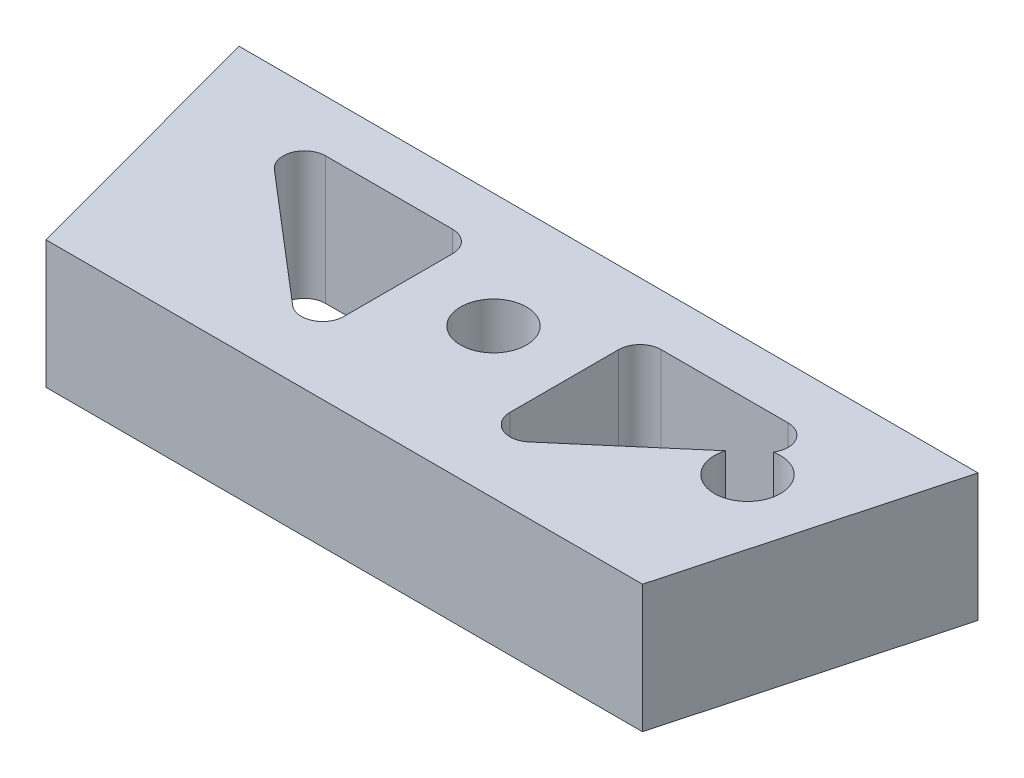
ISO-10303-21;
HEADER;
FILE_DESCRIPTION(('STEP AP214'),'2;1');
FILE_NAME('part.step','',(''),(''),'','','');
FILE_SCHEMA(('AUTOMOTIVE_DESIGN { 1 0 10303 214 1 1 1 1 }'));
ENDSEC;
DATA;
#1=APPLICATION_CONTEXT('core data for automotive mechanical design processes');
#2=APPLICATION_PROTOCOL_DEFINITION('international standard','automotive_design',2000,#1);
#3=PRODUCT_CONTEXT('',#1,'mechanical');
#4=PRODUCT('Part','Part','',(#3));
#5=PRODUCT_RELATED_PRODUCT_CATEGORY('part','',(#4));
#6=PRODUCT_DEFINITION_FORMATION('','',#4);
#7=PRODUCT_DEFINITION_CONTEXT('part definition',#1,'design');
#8=PRODUCT_DEFINITION('design','',#6,#7);
#9=PRODUCT_DEFINITION_SHAPE('','',#8);
#10=(LENGTH_UNIT() NAMED_UNIT(*) SI_UNIT(.MILLI.,.METRE.));
#11=(NAMED_UNIT(*) PLANE_ANGLE_UNIT() SI_UNIT($,.RADIAN.));
#12=(NAMED_UNIT(*) SI_UNIT($,.STERADIAN.) SOLID_ANGLE_UNIT());
#13=UNCERTAINTY_MEASURE_WITH_UNIT(LENGTH_MEASURE(1.E-05),#10,'distance_accuracy_value','');
#14=(GEOMETRIC_REPRESENTATION_CONTEXT(3) GLOBAL_UNCERTAINTY_ASSIGNED_CONTEXT((#13)) GLOBAL_UNIT_ASSIGNED_CONTEXT((#10,
#11,#12)) REPRESENTATION_CONTEXT('',''));
#15=CARTESIAN_POINT('',(0.,0.,0.));
#16=DIRECTION('',(0.,0.,1.));
#17=DIRECTION('',(1.,0.,0.));
#18=AXIS2_PLACEMENT_3D('',#15,#16,#17);
#19=CARTESIAN_POINT('',(0.,-1.,0.402774991180249));
#20=DIRECTION('',(0.,0.,1.));
#21=DIRECTION('',(1.,0.,0.));
#22=AXIS2_PLACEMENT_3D('',#19,#20,#21);
#23=PLANE('',#22);
#24=DIRECTION('',(0.,1.,0.));
#25=VECTOR('',#24,1.);
#26=CARTESIAN_POINT('',(-18.5018777464612,-1.,0.40277499118025));
#27=LINE('',#26,#25);
#28=CARTESIAN_POINT('',(-18.5018777464612,-1.,0.40277499118025));
#29=VERTEX_POINT('',#28);
#30=CARTESIAN_POINT('',(-18.5018777464612,5.,0.402774991180249));
#31=VERTEX_POINT('',#30);
#32=EDGE_CURVE('E204',#29,#31,#27,.T.);
#33=ORIENTED_EDGE('',*,*,#32,.T.);
#34=DIRECTION('',(-1.,0.,0.));
#35=VECTOR('',#34,1.);
#36=CARTESIAN_POINT('',(-18.5018777464612,5.,0.402774991180249));
#37=LINE('',#36,#35);
#38=CARTESIAN_POINT('',(16.1860491627566,5.,0.402774991180249));
#39=VERTEX_POINT('',#38);
#40=EDGE_CURVE('E278',#39,#31,#37,.T.);
#41=ORIENTED_EDGE('',*,*,#40,.F.);
#42=DIRECTION('',(0.,1.,0.));
#43=VECTOR('',#42,1.);
#44=CARTESIAN_POINT('',(16.1860491627566,-1.,0.402774991180249));
#45=LINE('',#44,#43);
#46=CARTESIAN_POINT('',(16.1860491627566,-1.,0.402774991180249));
#47=VERTEX_POINT('',#46);
#48=EDGE_CURVE('E48',#47,#39,#45,.T.);
#49=ORIENTED_EDGE('',*,*,#48,.F.);
#50=DIRECTION('',(1.,0.,0.));
#51=VECTOR('',#50,1.);
#52=CARTESIAN_POINT('',(0.,-1.,0.402774991180249));
#53=LINE('',#52,#51);
#54=EDGE_CURVE('E62',#29,#47,#53,.T.);
#55=ORIENTED_EDGE('',*,*,#54,.F.);
#56=EDGE_LOOP('',(#33,#41,#49,#55));
#57=FACE_BOUND('',#56,.T.);
#58=ADVANCED_FACE('F40',(#57),#23,.F.);
#59=CARTESIAN_POINT('',(15.1858113835841,-1.,4.10394808789721));
#60=DIRECTION('',(0.965368600757598,0.,0.260889755780707));
#61=DIRECTION('',(0.260889755780707,0.,-0.965368600757598));
#62=AXIS2_PLACEMENT_3D('',#59,#60,#61);
#63=PLANE('',#62);
#64=ORIENTED_EDGE('',*,*,#48,.T.);
#65=DIRECTION('',(0.260889755780707,0.,-0.965368600757598));
#66=VECTOR('',#65,1.);
#67=CARTESIAN_POINT('',(12.8349634022067,5.,12.8027749911802));
#68=LINE('',#67,#66);
#69=CARTESIAN_POINT('',(12.8349634022067,5.,12.8027749911802));
#70=VERTEX_POINT('',#69);
#71=EDGE_CURVE('E275',#70,#39,#68,.T.);
#72=ORIENTED_EDGE('',*,*,#71,.F.);
#73=DIRECTION('',(0.,1.,0.));
#74=VECTOR('',#73,1.);
#75=CARTESIAN_POINT('',(12.8349634022067,-1.,12.8027749911802));
#76=LINE('',#75,#74);
#77=CARTESIAN_POINT('',(12.8349634022067,-1.,12.8027749911802));
#78=VERTEX_POINT('',#77);
#79=EDGE_CURVE('E200',#78,#70,#76,.T.);
#80=ORIENTED_EDGE('',*,*,#79,.F.);
#81=DIRECTION('',(0.260889755780707,0.,-0.965368600757598));
#82=VECTOR('',#81,1.);
#83=CARTESIAN_POINT('',(15.1858113835841,-1.,4.10394808789721));
#84=LINE('',#83,#82);
#85=EDGE_CURVE('E195',#78,#47,#84,.T.);
#86=ORIENTED_EDGE('',*,*,#85,.T.);
#87=EDGE_LOOP('',(#64,#72,#80,#86));
#88=FACE_BOUND('',#87,.T.);
#89=ADVANCED_FACE('F328',(#88),#63,.T.);
#90=CARTESIAN_POINT('',(0.,-1.,12.8027749911803));
#91=DIRECTION('',(0.,0.,1.));
#92=DIRECTION('',(1.,0.,0.));
#93=AXIS2_PLACEMENT_3D('',#90,#91,#92);
#94=PLANE('',#93);
#95=ORIENTED_EDGE('',*,*,#79,.T.);
#96=DIRECTION('',(1.,0.,0.));
#97=VECTOR('',#96,1.);
#98=CARTESIAN_POINT('',(-15.1650365977933,5.,12.8027749911802));
#99=LINE('',#98,#97);
#100=CARTESIAN_POINT('',(-15.1650365977933,5.,12.8027749911802));
#101=VERTEX_POINT('',#100);
#102=EDGE_CURVE('E272',#101,#70,#99,.T.);
#103=ORIENTED_EDGE('',*,*,#102,.F.);
#104=DIRECTION('',(0.,1.,0.));
#105=VECTOR('',#104,1.);
#106=CARTESIAN_POINT('',(-15.1650365977933,-1.,12.8027749911802));
#107=LINE('',#106,#105);
#108=CARTESIAN_POINT('',(-15.1650365977933,-1.,12.8027749911802));
#109=VERTEX_POINT('',#108);
#110=EDGE_CURVE('E202',#109,#101,#107,.T.);
#111=ORIENTED_EDGE('',*,*,#110,.F.);
#112=DIRECTION('',(1.,0.,0.));
#113=VECTOR('',#112,1.);
#114=CARTESIAN_POINT('',(0.,-1.,12.8027749911803));
#115=LINE('',#114,#113);
#116=EDGE_CURVE('E192',#109,#78,#115,.T.);
#117=ORIENTED_EDGE('',*,*,#116,.T.);
#118=EDGE_LOOP('',(#95,#103,#111,#117));
#119=FACE_BOUND('',#118,.T.);
#120=ADVANCED_FACE('F334',(#119),#94,.T.);
#121=CARTESIAN_POINT('',(3.74005149891533,-1.,3.82742354793275));
#122=DIRECTION('',(0.,1.,0.));
#123=DIRECTION('',(0.,0.,1.));
#124=AXIS2_PLACEMENT_3D('',#121,#122,#123);
#125=CYLINDRICAL_SURFACE('',#124,1.);
#126=DIRECTION('',(0.,1.,0.));
#127=VECTOR('',#126,1.);
#128=CARTESIAN_POINT('',(3.74005149891533,-1.,2.82742354793275));
#129=LINE('',#128,#127);
#130=CARTESIAN_POINT('',(3.74005149891533,-1.,2.82742354793275));
#131=VERTEX_POINT('',#130);
#132=CARTESIAN_POINT('',(3.74005149891533,5.,2.82742354793275));
#133=VERTEX_POINT('',#132);
#134=EDGE_CURVE('E215',#131,#133,#129,.T.);
#135=ORIENTED_EDGE('',*,*,#134,.T.);
#136=CARTESIAN_POINT('',(3.74005149891533,5.,3.82742354793275));
#137=DIRECTION('',(0.,1.,0.));
#138=DIRECTION('',(0.,0.,1.));
#139=AXIS2_PLACEMENT_3D('',#136,#137,#138);
#140=CIRCLE('',#139,1.);
#141=CARTESIAN_POINT('',(2.74005149891533,5.,3.82742354793275));
#142=VERTEX_POINT('',#141);
#143=EDGE_CURVE('E266',#133,#142,#140,.T.);
#144=ORIENTED_EDGE('',*,*,#143,.T.);
#145=DIRECTION('',(0.,1.,0.));
#146=VECTOR('',#145,1.);
#147=CARTESIAN_POINT('',(2.74005149891533,-1.,3.82742354793275));
#148=LINE('',#147,#146);
#149=CARTESIAN_POINT('',(2.74005149891533,-1.,3.82742354793275));
#150=VERTEX_POINT('',#149);
#151=EDGE_CURVE('E206',#150,#142,#148,.T.);
#152=ORIENTED_EDGE('',*,*,#151,.F.);
#153=CARTESIAN_POINT('',(3.74005149891533,-1.,3.82742354793275));
#154=DIRECTION('',(0.,1.,0.));
#155=DIRECTION('',(0.,0.,1.));
#156=AXIS2_PLACEMENT_3D('',#153,#154,#155);
#157=CIRCLE('',#156,1.);
#158=EDGE_CURVE('E296',#131,#150,#157,.T.);
#159=ORIENTED_EDGE('',*,*,#158,.F.);
#160=EDGE_LOOP('',(#135,#144,#152,#159));
#161=FACE_BOUND('',#160,.T.);
#162=ADVANCED_FACE('F314',(#161),#125,.F.);
#163=CARTESIAN_POINT('',(2.74005149891533,-1.,0.));
#164=DIRECTION('',(1.,0.,0.));
#165=DIRECTION('',(0.,0.,-1.));
#166=AXIS2_PLACEMENT_3D('',#163,#164,#165);
#167=PLANE('',#166);
#168=ORIENTED_EDGE('',*,*,#151,.T.);
#169=DIRECTION('',(0.,0.,1.));
#170=VECTOR('',#169,1.);
#171=CARTESIAN_POINT('',(2.74005149891533,5.,8.92453681504574));
#172=LINE('',#171,#170);
#173=CARTESIAN_POINT('',(2.74005149891533,5.,8.92453681504574));
#174=VERTEX_POINT('',#173);
#175=EDGE_CURVE('E269',#142,#174,#172,.T.);
#176=ORIENTED_EDGE('',*,*,#175,.T.);
#177=DIRECTION('',(0.,1.,0.));
#178=VECTOR('',#177,1.);
#179=CARTESIAN_POINT('',(2.74005149891533,-1.,8.92453681504574));
#180=LINE('',#179,#178);
#181=CARTESIAN_POINT('',(2.74005149891533,-1.,8.92453681504574));
#182=VERTEX_POINT('',#181);
#183=EDGE_CURVE('E208',#182,#174,#180,.T.);
#184=ORIENTED_EDGE('',*,*,#183,.F.);
#185=DIRECTION('',(0.,0.,-1.));
#186=VECTOR('',#185,1.);
#187=CARTESIAN_POINT('',(2.74005149891533,-1.,0.));
#188=LINE('',#187,#186);
#189=EDGE_CURVE('E181',#182,#150,#188,.T.);
#190=ORIENTED_EDGE('',*,*,#189,.T.);
#191=EDGE_LOOP('',(#168,#176,#184,#190));
#192=FACE_BOUND('',#191,.T.);
#193=ADVANCED_FACE('F316',(#192),#167,.T.);
#194=CARTESIAN_POINT('',(3.74005149891534,-1.,8.92453681504574));
#195=DIRECTION('',(0.,1.,0.));
#196=DIRECTION('',(0.,0.,1.));
#197=AXIS2_PLACEMENT_3D('',#194,#195,#196);
#198=CYLINDRICAL_SURFACE('',#197,1.);
#199=ORIENTED_EDGE('',*,*,#183,.T.);
#200=CARTESIAN_POINT('',(3.74005149891534,5.,8.92453681504574));
#201=DIRECTION('',(0.,1.,0.));
#202=DIRECTION('',(0.,0.,-1.));
#203=AXIS2_PLACEMENT_3D('',#200,#201,#202);
#204=CIRCLE('',#203,1.);
#205=CARTESIAN_POINT('',(4.39031250669478,5.,9.68424769542172));
#206=VERTEX_POINT('',#205);
#207=EDGE_CURVE('E254',#174,#206,#204,.T.);
#208=ORIENTED_EDGE('',*,*,#207,.T.);
#209=DIRECTION('',(0.,1.,0.));
#210=VECTOR('',#209,1.);
#211=CARTESIAN_POINT('',(4.39031250669478,-1.,9.68424769542172));
#212=LINE('',#211,#210);
#213=CARTESIAN_POINT('',(4.39031250669478,-1.,9.68424769542172));
#214=VERTEX_POINT('',#213);
#215=EDGE_CURVE('E210',#214,#206,#212,.T.);
#216=ORIENTED_EDGE('',*,*,#215,.F.);
#217=CARTESIAN_POINT('',(3.74005149891534,-1.,8.92453681504574));
#218=DIRECTION('',(0.,1.,0.));
#219=DIRECTION('',(0.,0.,1.));
#220=AXIS2_PLACEMENT_3D('',#217,#218,#219);
#221=CIRCLE('',#220,1.);
#222=EDGE_CURVE('E178',#214,#182,#221,.F.);
#223=ORIENTED_EDGE('',*,*,#222,.T.);
#224=EDGE_LOOP('',(#199,#208,#216,#223));
#225=FACE_BOUND('',#224,.T.);
#226=ADVANCED_FACE('F318',(#225),#198,.F.);
#227=CARTESIAN_POINT('',(6.64051572703957,-1.,7.75822629495711));
#228=DIRECTION('',(-0.650261007779447,0.,-0.759710880375987));
#229=DIRECTION('',(-0.759710880375987,0.,0.650261007779447));
#230=AXIS2_PLACEMENT_3D('',#227,#228,#229);
#231=PLANE('',#230);
#232=DIRECTION('',(0.,1.,0.));
#233=VECTOR('',#232,1.);
#234=CARTESIAN_POINT('',(9.35916887958185,-5.38406204335659,5.43124351184889));
#235=LINE('',#234,#233);
#236=CARTESIAN_POINT('',(9.35916887958185,-1.,5.43124351184889));
#237=VERTEX_POINT('',#236);
#238=CARTESIAN_POINT('',(9.35916887958185,5.,5.43124351184889));
#239=VERTEX_POINT('',#238);
#240=EDGE_CURVE('E54',#237,#239,#235,.T.);
#241=ORIENTED_EDGE('',*,*,#240,.F.);
#242=DIRECTION('',(-0.759710880375987,0.,0.650261007779447));
#243=VECTOR('',#242,1.);
#244=CARTESIAN_POINT('',(6.64051572703957,-1.,7.75822629495711));
#245=LINE('',#244,#243);
#246=EDGE_CURVE('E168',#237,#214,#245,.T.);
#247=ORIENTED_EDGE('',*,*,#246,.T.);
#248=ORIENTED_EDGE('',*,*,#215,.T.);
#249=DIRECTION('',(0.759710880375987,0.,-0.650261007779447));
#250=VECTOR('',#249,1.);
#251=CARTESIAN_POINT('',(10.3453557296585,5.,4.58713442830873));
#252=LINE('',#251,#250);
#253=EDGE_CURVE('E171',#206,#239,#252,.T.);
#254=ORIENTED_EDGE('',*,*,#253,.T.);
#255=EDGE_LOOP('',(#241,#247,#248,#254));
#256=FACE_BOUND('',#255,.T.);
#257=ADVANCED_FACE('F167',(#256),#231,.T.);
#258=CARTESIAN_POINT('',(9.69509472187902,-1.,3.82742354793275));
#259=DIRECTION('',(0.,1.,0.));
#260=DIRECTION('',(0.,0.,1.));
#261=AXIS2_PLACEMENT_3D('',#258,#259,#260);
#262=CYLINDRICAL_SURFACE('',#261,1.);
#263=CARTESIAN_POINT('',(9.69509472187902,-1.,3.82742354793275));
#264=DIRECTION('',(0.,1.,0.));
#265=DIRECTION('',(0.,0.,1.));
#266=AXIS2_PLACEMENT_3D('',#263,#264,#265);
#267=CIRCLE('',#266,1.);
#268=CARTESIAN_POINT('',(10.5402249757453,-1.,4.36198397856702));
#269=VERTEX_POINT('',#268);
#270=CARTESIAN_POINT('',(9.69509472187902,-1.,2.82742354793275));
#271=VERTEX_POINT('',#270);
#272=EDGE_CURVE('E179',#269,#271,#267,.T.);
#273=ORIENTED_EDGE('',*,*,#272,.F.);
#274=DIRECTION('',(0.,1.,0.));
#275=VECTOR('',#274,1.);
#276=CARTESIAN_POINT('',(10.5402249757453,2.,4.36198397856702));
#277=LINE('',#276,#275);
#278=CARTESIAN_POINT('',(10.5402249757453,5.,4.36198397856702));
#279=VERTEX_POINT('',#278);
#280=EDGE_CURVE('E160',#269,#279,#277,.T.);
#281=ORIENTED_EDGE('',*,*,#280,.T.);
#282=CARTESIAN_POINT('',(9.69509472187902,5.,3.82742354793275));
#283=DIRECTION('',(0.,1.,0.));
#284=DIRECTION('',(0.,0.,1.));
#285=AXIS2_PLACEMENT_3D('',#282,#283,#284);
#286=CIRCLE('',#285,1.);
#287=CARTESIAN_POINT('',(9.69509472187902,5.,2.82742354793275));
#288=VERTEX_POINT('',#287);
#289=EDGE_CURVE('E261',#279,#288,#286,.T.);
#290=ORIENTED_EDGE('',*,*,#289,.T.);
#291=DIRECTION('',(0.,1.,0.));
#292=VECTOR('',#291,1.);
#293=CARTESIAN_POINT('',(9.69509472187902,-1.,2.82742354793275));
#294=LINE('',#293,#292);
#295=EDGE_CURVE('E212',#271,#288,#294,.T.);
#296=ORIENTED_EDGE('',*,*,#295,.F.);
#297=EDGE_LOOP('',(#273,#281,#290,#296));
#298=FACE_BOUND('',#297,.T.);
#299=ADVANCED_FACE('F306',(#298),#262,.F.);
#300=CARTESIAN_POINT('',(-12.0109233055837,-1.,3.82742354793275));
#301=DIRECTION('',(0.,1.,0.));
#302=DIRECTION('',(0.,0.,1.));
#303=AXIS2_PLACEMENT_3D('',#300,#301,#302);
#304=CYLINDRICAL_SURFACE('',#303,1.);
#305=DIRECTION('',(0.,1.,0.));
#306=VECTOR('',#305,1.);
#307=CARTESIAN_POINT('',(-12.0109233055837,-1.,2.82742354793275));
#308=LINE('',#307,#306);
#309=CARTESIAN_POINT('',(-12.0109233055837,-1.,2.82742354793275));
#310=VERTEX_POINT('',#309);
#311=CARTESIAN_POINT('',(-12.0109233055837,5.,2.82742354793275));
#312=VERTEX_POINT('',#311);
#313=EDGE_CURVE('E198',#310,#312,#308,.T.);
#314=ORIENTED_EDGE('',*,*,#313,.T.);
#315=CARTESIAN_POINT('',(-12.0109233055837,5.,3.82742354793275));
#316=DIRECTION('',(0.,1.,0.));
#317=DIRECTION('',(0.,0.,1.));
#318=AXIS2_PLACEMENT_3D('',#315,#316,#317);
#319=CIRCLE('',#318,1.);
#320=CARTESIAN_POINT('',(-12.6611843133631,5.,4.58713442830874));
#321=VERTEX_POINT('',#320);
#322=EDGE_CURVE('E233',#312,#321,#319,.T.);
#323=ORIENTED_EDGE('',*,*,#322,.T.);
#324=DIRECTION('',(0.,1.,0.));
#325=VECTOR('',#324,1.);
#326=CARTESIAN_POINT('',(-12.6611843133631,-1.,4.58713442830874));
#327=LINE('',#326,#325);
#328=CARTESIAN_POINT('',(-12.6611843133631,-1.,4.58713442830874));
#329=VERTEX_POINT('',#328);
#330=EDGE_CURVE('E217',#329,#321,#327,.T.);
#331=ORIENTED_EDGE('',*,*,#330,.F.);
#332=CARTESIAN_POINT('',(-12.0109233055837,-1.,3.82742354793275));
#333=DIRECTION('',(0.,1.,0.));
#334=DIRECTION('',(0.,0.,1.));
#335=AXIS2_PLACEMENT_3D('',#332,#333,#334);
#336=CIRCLE('',#335,1.);
#337=EDGE_CURVE('E236',#310,#329,#336,.T.);
#338=ORIENTED_EDGE('',*,*,#337,.F.);
#339=EDGE_LOOP('',(#314,#323,#331,#338));
#340=FACE_BOUND('',#339,.T.);
#341=ADVANCED_FACE('F42',(#340),#304,.F.);
#342=CARTESIAN_POINT('',(-7.61973924547981,-1.,8.90226961353088));
#343=DIRECTION('',(-0.650261007779446,0.,0.759710880375988));
#344=DIRECTION('',(0.759710880375988,0.,0.650261007779446));
#345=AXIS2_PLACEMENT_3D('',#342,#343,#344);
#346=PLANE('',#345);
#347=ORIENTED_EDGE('',*,*,#330,.T.);
#348=DIRECTION('',(0.759710880375988,0.,0.650261007779446));
#349=VECTOR('',#348,1.);
#350=CARTESIAN_POINT('',(-12.6611843133631,5.,4.58713442830874));
#351=LINE('',#350,#349);
#352=CARTESIAN_POINT('',(-6.70614109039943,5.,9.68424769542171));
#353=VERTEX_POINT('',#352);
#354=EDGE_CURVE('E252',#321,#353,#351,.T.);
#355=ORIENTED_EDGE('',*,*,#354,.T.);
#356=DIRECTION('',(0.,1.,0.));
#357=VECTOR('',#356,1.);
#358=CARTESIAN_POINT('',(-6.70614109039943,-1.,9.68424769542171));
#359=LINE('',#358,#357);
#360=CARTESIAN_POINT('',(-6.70614109039943,-1.,9.68424769542171));
#361=VERTEX_POINT('',#360);
#362=EDGE_CURVE('E219',#361,#353,#359,.T.);
#363=ORIENTED_EDGE('',*,*,#362,.F.);
#364=DIRECTION('',(0.759710880375988,0.,0.650261007779446));
#365=VECTOR('',#364,1.);
#366=CARTESIAN_POINT('',(-7.61973924547981,-1.,8.90226961353088));
#367=LINE('',#366,#365);
#368=EDGE_CURVE('E294',#329,#361,#367,.T.);
#369=ORIENTED_EDGE('',*,*,#368,.F.);
#370=EDGE_LOOP('',(#347,#355,#363,#369));
#371=FACE_BOUND('',#370,.T.);
#372=ADVANCED_FACE('F409',(#371),#346,.F.);
#373=CARTESIAN_POINT('',(-6.05588008261997,-1.,8.92453681504573));
#374=DIRECTION('',(0.,1.,0.));
#375=DIRECTION('',(0.,0.,1.));
#376=AXIS2_PLACEMENT_3D('',#373,#374,#375);
#377=CYLINDRICAL_SURFACE('',#376,1.);
#378=ORIENTED_EDGE('',*,*,#362,.T.);
#379=CARTESIAN_POINT('',(-6.05588008261997,5.,8.92453681504573));
#380=DIRECTION('',(0.,1.,0.));
#381=DIRECTION('',(0.,0.,-1.));
#382=AXIS2_PLACEMENT_3D('',#379,#380,#381);
#383=CIRCLE('',#382,1.);
#384=CARTESIAN_POINT('',(-5.05588008261997,5.,8.92453681504573));
#385=VERTEX_POINT('',#384);
#386=EDGE_CURVE('E563',#353,#385,#383,.T.);
#387=ORIENTED_EDGE('',*,*,#386,.T.);
#388=DIRECTION('',(0.,1.,0.));
#389=VECTOR('',#388,1.);
#390=CARTESIAN_POINT('',(-5.05588008261997,-1.,8.92453681504573));
#391=LINE('',#390,#389);
#392=CARTESIAN_POINT('',(-5.05588008261997,-1.,8.92453681504573));
#393=VERTEX_POINT('',#392);
#394=EDGE_CURVE('E221',#393,#385,#391,.T.);
#395=ORIENTED_EDGE('',*,*,#394,.F.);
#396=CARTESIAN_POINT('',(-6.05588008261997,-1.,8.92453681504573));
#397=DIRECTION('',(0.,1.,0.));
#398=DIRECTION('',(0.,0.,1.));
#399=AXIS2_PLACEMENT_3D('',#396,#397,#398);
#400=CIRCLE('',#399,1.);
#401=EDGE_CURVE('E291',#393,#361,#400,.F.);
#402=ORIENTED_EDGE('',*,*,#401,.T.);
#403=EDGE_LOOP('',(#378,#387,#395,#402));
#404=FACE_BOUND('',#403,.T.);
#405=ADVANCED_FACE('F401',(#404),#377,.F.);
#406=CARTESIAN_POINT('',(-5.05588008261997,-1.,0.));
#407=DIRECTION('',(1.,0.,0.));
#408=DIRECTION('',(0.,0.,-1.));
#409=AXIS2_PLACEMENT_3D('',#406,#407,#408);
#410=PLANE('',#409);
#411=ORIENTED_EDGE('',*,*,#394,.T.);
#412=DIRECTION('',(0.,0.,-1.));
#413=VECTOR('',#412,1.);
#414=CARTESIAN_POINT('',(-5.05588008261997,5.,8.92453681504573));
#415=LINE('',#414,#413);
#416=CARTESIAN_POINT('',(-5.05588008261997,5.,3.82742354793275));
#417=VERTEX_POINT('',#416);
#418=EDGE_CURVE('E562',#385,#417,#415,.T.);
#419=ORIENTED_EDGE('',*,*,#418,.T.);
#420=DIRECTION('',(0.,1.,0.));
#421=VECTOR('',#420,1.);
#422=CARTESIAN_POINT('',(-5.05588008261997,-1.,3.82742354793275));
#423=LINE('',#422,#421);
#424=CARTESIAN_POINT('',(-5.05588008261997,-1.,3.82742354793275));
#425=VERTEX_POINT('',#424);
#426=EDGE_CURVE('E223',#425,#417,#423,.T.);
#427=ORIENTED_EDGE('',*,*,#426,.F.);
#428=DIRECTION('',(0.,0.,-1.));
#429=VECTOR('',#428,1.);
#430=CARTESIAN_POINT('',(-5.05588008261997,-1.,0.));
#431=LINE('',#430,#429);
#432=EDGE_CURVE('E289',#393,#425,#431,.T.);
#433=ORIENTED_EDGE('',*,*,#432,.F.);
#434=EDGE_LOOP('',(#411,#419,#427,#433));
#435=FACE_BOUND('',#434,.T.);
#436=ADVANCED_FACE('F393',(#435),#410,.F.);
#437=CARTESIAN_POINT('',(-6.05588008261997,-1.,3.82742354793275));
#438=DIRECTION('',(0.,1.,0.));
#439=DIRECTION('',(0.,0.,1.));
#440=AXIS2_PLACEMENT_3D('',#437,#438,#439);
#441=CYLINDRICAL_SURFACE('',#440,1.);
#442=ORIENTED_EDGE('',*,*,#426,.T.);
#443=CARTESIAN_POINT('',(-6.05588008261997,5.,3.82742354793275));
#444=DIRECTION('',(0.,1.,0.));
#445=DIRECTION('',(0.,0.,1.));
#446=AXIS2_PLACEMENT_3D('',#443,#444,#445);
#447=CIRCLE('',#446,1.);
#448=CARTESIAN_POINT('',(-6.05588008261997,5.,2.82742354793275));
#449=VERTEX_POINT('',#448);
#450=EDGE_CURVE('E246',#417,#449,#447,.T.);
#451=ORIENTED_EDGE('',*,*,#450,.T.);
#452=DIRECTION('',(0.,1.,0.));
#453=VECTOR('',#452,1.);
#454=CARTESIAN_POINT('',(-6.05588008261997,-1.,2.82742354793275));
#455=LINE('',#454,#453);
#456=CARTESIAN_POINT('',(-6.05588008261997,-1.,2.82742354793275));
#457=VERTEX_POINT('',#456);
#458=EDGE_CURVE('E225',#457,#449,#455,.T.);
#459=ORIENTED_EDGE('',*,*,#458,.F.);
#460=CARTESIAN_POINT('',(-6.05588008261997,-1.,3.82742354793275));
#461=DIRECTION('',(0.,1.,0.));
#462=DIRECTION('',(0.,0.,1.));
#463=AXIS2_PLACEMENT_3D('',#460,#461,#462);
#464=CIRCLE('',#463,1.);
#465=EDGE_CURVE('E287',#425,#457,#464,.T.);
#466=ORIENTED_EDGE('',*,*,#465,.F.);
#467=EDGE_LOOP('',(#442,#451,#459,#466));
#468=FACE_BOUND('',#467,.T.);
#469=ADVANCED_FACE('F386',(#468),#441,.F.);
#470=CARTESIAN_POINT('',(0.,-1.,2.82742354793275));
#471=DIRECTION('',(0.,0.,1.));
#472=DIRECTION('',(1.,0.,0.));
#473=AXIS2_PLACEMENT_3D('',#470,#471,#472);
#474=PLANE('',#473);
#475=ORIENTED_EDGE('',*,*,#295,.T.);
#476=DIRECTION('',(-1.,0.,0.));
#477=VECTOR('',#476,1.);
#478=CARTESIAN_POINT('',(3.74005149891533,5.,2.82742354793275));
#479=LINE('',#478,#477);
#480=EDGE_CURVE('E263',#288,#133,#479,.T.);
#481=ORIENTED_EDGE('',*,*,#480,.T.);
#482=ORIENTED_EDGE('',*,*,#134,.F.);
#483=DIRECTION('',(1.,0.,0.));
#484=VECTOR('',#483,1.);
#485=CARTESIAN_POINT('',(0.,-1.,2.82742354793275));
#486=LINE('',#485,#484);
#487=EDGE_CURVE('E183',#131,#271,#486,.T.);
#488=ORIENTED_EDGE('',*,*,#487,.T.);
#489=EDGE_LOOP('',(#475,#481,#482,#488));
#490=FACE_BOUND('',#489,.T.);
#491=ADVANCED_FACE('F300',(#490),#474,.T.);
#492=CARTESIAN_POINT('',(0.,-1.,2.82742354793275));
#493=DIRECTION('',(0.,0.,-1.));
#494=DIRECTION('',(-1.,0.,0.));
#495=AXIS2_PLACEMENT_3D('',#492,#493,#494);
#496=PLANE('',#495);
#497=ORIENTED_EDGE('',*,*,#458,.T.);
#498=DIRECTION('',(-1.,0.,0.));
#499=VECTOR('',#498,1.);
#500=CARTESIAN_POINT('',(-6.05588008261997,5.,2.82742354793275));
#501=LINE('',#500,#499);
#502=EDGE_CURVE('E240',#449,#312,#501,.T.);
#503=ORIENTED_EDGE('',*,*,#502,.T.);
#504=ORIENTED_EDGE('',*,*,#313,.F.);
#505=DIRECTION('',(-1.,0.,0.));
#506=VECTOR('',#505,1.);
#507=CARTESIAN_POINT('',(0.,-1.,2.82742354793275));
#508=LINE('',#507,#506);
#509=EDGE_CURVE('E285',#457,#310,#508,.T.);
#510=ORIENTED_EDGE('',*,*,#509,.F.);
#511=EDGE_LOOP('',(#497,#503,#504,#510));
#512=FACE_BOUND('',#511,.T.);
#513=ADVANCED_FACE('F241',(#512),#496,.F.);
#514=CARTESIAN_POINT('',(-17.353605615274,-1.,4.66985687861304));
#515=DIRECTION('',(0.965647428770982,0.,-0.25985581253455));
#516=DIRECTION('',(-0.25985581253455,0.,-0.965647428770982));
#517=AXIS2_PLACEMENT_3D('',#514,#515,#516);
#518=PLANE('',#517);
#519=ORIENTED_EDGE('',*,*,#110,.T.);
#520=DIRECTION('',(0.25985581253455,0.,0.965647428770982));
#521=VECTOR('',#520,1.);
#522=CARTESIAN_POINT('',(-15.1650365977933,5.,12.8027749911802));
#523=LINE('',#522,#521);
#524=EDGE_CURVE('E281',#31,#101,#523,.T.);
#525=ORIENTED_EDGE('',*,*,#524,.F.);
#526=ORIENTED_EDGE('',*,*,#32,.F.);
#527=DIRECTION('',(-0.25985581253455,0.,-0.965647428770982));
#528=VECTOR('',#527,1.);
#529=CARTESIAN_POINT('',(-17.353605615274,-1.,4.66985687861304));
#530=LINE('',#529,#528);
#531=EDGE_CURVE('E190',#109,#29,#530,.T.);
#532=ORIENTED_EDGE('',*,*,#531,.F.);
#533=EDGE_LOOP('',(#519,#525,#526,#532));
#534=FACE_BOUND('',#533,.T.);
#535=ADVANCED_FACE('F338',(#534),#518,.F.);
#536=CARTESIAN_POINT('',(0.,-1.,0.));
#537=DIRECTION('',(0.,1.,0.));
#538=DIRECTION('',(0.,0.,1.));
#539=AXIS2_PLACEMENT_3D('',#536,#537,#538);
#540=PLANE('',#539);
#541=CARTESIAN_POINT('',(-1.15791429185232,-1.,5.80277499118023));
#542=DIRECTION('',(0.,1.,0.));
#543=DIRECTION('',(0.,0.,1.));
#544=AXIS2_PLACEMENT_3D('',#541,#542,#543);
#545=CIRCLE('',#544,1.55);
#546=CARTESIAN_POINT('',(-1.15791429185232,-1.,7.35277499118023));
#547=VERTEX_POINT('',#546);
#548=EDGE_CURVE('E568',#547,#547,#545,.F.);
#549=ORIENTED_EDGE('',*,*,#548,.F.);
#550=EDGE_LOOP('',(#549));
#551=FACE_BOUND('',#550,.T.);
#552=ORIENTED_EDGE('',*,*,#337,.T.);
#553=ORIENTED_EDGE('',*,*,#368,.T.);
#554=ORIENTED_EDGE('',*,*,#401,.F.);
#555=ORIENTED_EDGE('',*,*,#432,.T.);
#556=ORIENTED_EDGE('',*,*,#465,.T.);
#557=ORIENTED_EDGE('',*,*,#509,.T.);
#558=EDGE_LOOP('',(#552,#553,#554,#555,#556,#557));
#559=FACE_BOUND('',#558,.T.);
#560=ORIENTED_EDGE('',*,*,#246,.F.);
#561=CARTESIAN_POINT('',(10.8420857081477,-1.,5.88230634511745));
#562=DIRECTION('',(0.,1.,0.));
#563=DIRECTION('',(0.,0.,1.));
#564=AXIS2_PLACEMENT_3D('',#561,#562,#563);
#565=CIRCLE('',#564,1.55);
#566=EDGE_CURVE('E157',#269,#237,#565,.F.);
#567=ORIENTED_EDGE('',*,*,#566,.F.);
#568=ORIENTED_EDGE('',*,*,#272,.T.);
#569=ORIENTED_EDGE('',*,*,#487,.F.);
#570=ORIENTED_EDGE('',*,*,#158,.T.);
#571=ORIENTED_EDGE('',*,*,#189,.F.);
#572=ORIENTED_EDGE('',*,*,#222,.F.);
#573=EDGE_LOOP('',(#560,#567,#568,#569,#570,#571,#572));
#574=FACE_BOUND('',#573,.T.);
#575=ORIENTED_EDGE('',*,*,#54,.T.);
#576=ORIENTED_EDGE('',*,*,#85,.F.);
#577=ORIENTED_EDGE('',*,*,#116,.F.);
#578=ORIENTED_EDGE('',*,*,#531,.T.);
#579=EDGE_LOOP('',(#575,#576,#577,#578));
#580=FACE_BOUND('',#579,.T.);
#581=ADVANCED_FACE('F175',(#551,#559,#574,#580),#540,.F.);
#582=CARTESIAN_POINT('',(0.,5.,0.));
#583=DIRECTION('',(0.,1.,0.));
#584=DIRECTION('',(0.,0.,1.));
#585=AXIS2_PLACEMENT_3D('',#582,#583,#584);
#586=PLANE('',#585);
#587=CARTESIAN_POINT('',(10.8420857081477,5.,5.88230634511745));
#588=DIRECTION('',(0.,1.,0.));
#589=DIRECTION('',(0.,0.,1.));
#590=AXIS2_PLACEMENT_3D('',#587,#588,#589);
#591=CIRCLE('',#590,1.55);
#592=EDGE_CURVE('E11',#239,#279,#591,.T.);
#593=ORIENTED_EDGE('',*,*,#592,.F.);
#594=ORIENTED_EDGE('',*,*,#253,.F.);
#595=ORIENTED_EDGE('',*,*,#207,.F.);
#596=ORIENTED_EDGE('',*,*,#175,.F.);
#597=ORIENTED_EDGE('',*,*,#143,.F.);
#598=ORIENTED_EDGE('',*,*,#480,.F.);
#599=ORIENTED_EDGE('',*,*,#289,.F.);
#600=EDGE_LOOP('',(#593,#594,#595,#596,#597,#598,#599));
#601=FACE_BOUND('',#600,.T.);
#602=CARTESIAN_POINT('',(-1.15791429185232,5.,5.80277499118023));
#603=DIRECTION('',(0.,1.,0.));
#604=DIRECTION('',(0.,0.,1.));
#605=AXIS2_PLACEMENT_3D('',#602,#603,#604);
#606=CIRCLE('',#605,1.55);
#607=CARTESIAN_POINT('',(-1.15791429185232,5.,7.35277499118023));
#608=VERTEX_POINT('',#607);
#609=EDGE_CURVE('E172',#608,#608,#606,.T.);
#610=ORIENTED_EDGE('',*,*,#609,.F.);
#611=EDGE_LOOP('',(#610));
#612=FACE_BOUND('',#611,.T.);
#613=ORIENTED_EDGE('',*,*,#102,.T.);
#614=ORIENTED_EDGE('',*,*,#71,.T.);
#615=ORIENTED_EDGE('',*,*,#40,.T.);
#616=ORIENTED_EDGE('',*,*,#524,.T.);
#617=EDGE_LOOP('',(#613,#614,#615,#616));
#618=FACE_BOUND('',#617,.T.);
#619=ORIENTED_EDGE('',*,*,#418,.F.);
#620=ORIENTED_EDGE('',*,*,#386,.F.);
#621=ORIENTED_EDGE('',*,*,#354,.F.);
#622=ORIENTED_EDGE('',*,*,#322,.F.);
#623=ORIENTED_EDGE('',*,*,#502,.F.);
#624=ORIENTED_EDGE('',*,*,#450,.F.);
#625=EDGE_LOOP('',(#619,#620,#621,#622,#623,#624));
#626=FACE_BOUND('',#625,.T.);
#627=ADVANCED_FACE('F249',(#601,#612,#618,#626),#586,.T.);
#628=CARTESIAN_POINT('',(-1.15791429185232,-1.001,5.80277499118023));
#629=DIRECTION('',(0.,1.,0.));
#630=DIRECTION('',(0.,0.,1.));
#631=AXIS2_PLACEMENT_3D('',#628,#629,#630);
#632=CYLINDRICAL_SURFACE('',#631,1.55);
#633=CARTESIAN_POINT('',(-1.15791429185232,5.,7.35277499118023));
#634=CARTESIAN_POINT('',(-1.15791429185232,4.9375,7.35277499118023));
#635=CARTESIAN_POINT('',(-1.15791429185232,4.875,7.35277499118023));
#636=CARTESIAN_POINT('',(-1.15791429185232,4.75,7.35277499118023));
#637=CARTESIAN_POINT('',(-1.15791429185232,4.6875,7.35277499118023));
#638=CARTESIAN_POINT('',(-1.15791429185232,4.5625,7.35277499118023));
#639=CARTESIAN_POINT('',(-1.15791429185232,4.5,7.35277499118023));
#640=CARTESIAN_POINT('',(-1.15791429185232,4.375,7.35277499118023));
#641=CARTESIAN_POINT('',(-1.15791429185232,4.3125,7.35277499118023));
#642=CARTESIAN_POINT('',(-1.15791429185232,4.1875,7.35277499118023));
#643=CARTESIAN_POINT('',(-1.15791429185232,4.125,7.35277499118023));
#644=CARTESIAN_POINT('',(-1.15791429185232,4.,7.35277499118023));
#645=CARTESIAN_POINT('',(-1.15791429185232,3.9375,7.35277499118023));
#646=CARTESIAN_POINT('',(-1.15791429185232,3.8125,7.35277499118023));
#647=CARTESIAN_POINT('',(-1.15791429185232,3.75,7.35277499118023));
#648=CARTESIAN_POINT('',(-1.15791429185232,3.625,7.35277499118023));
#649=CARTESIAN_POINT('',(-1.15791429185232,3.5625,7.35277499118023));
#650=CARTESIAN_POINT('',(-1.15791429185232,3.4375,7.35277499118023));
#651=CARTESIAN_POINT('',(-1.15791429185232,3.375,7.35277499118023));
#652=CARTESIAN_POINT('',(-1.15791429185232,3.25,7.35277499118023));
#653=CARTESIAN_POINT('',(-1.15791429185232,3.1875,7.35277499118023));
#654=CARTESIAN_POINT('',(-1.15791429185232,3.0625,7.35277499118023));
#655=CARTESIAN_POINT('',(-1.15791429185232,3.,7.35277499118023));
#656=CARTESIAN_POINT('',(-1.15791429185232,2.875,7.35277499118023));
#657=CARTESIAN_POINT('',(-1.15791429185232,2.8125,7.35277499118023));
#658=CARTESIAN_POINT('',(-1.15791429185232,2.6875,7.35277499118023));
#659=CARTESIAN_POINT('',(-1.15791429185232,2.625,7.35277499118023));
#660=CARTESIAN_POINT('',(-1.15791429185232,2.5,7.35277499118023));
#661=CARTESIAN_POINT('',(-1.15791429185232,2.4375,7.35277499118023));
#662=CARTESIAN_POINT('',(-1.15791429185232,2.3125,7.35277499118023));
#663=CARTESIAN_POINT('',(-1.15791429185232,2.25,7.35277499118023));
#664=CARTESIAN_POINT('',(-1.15791429185232,2.125,7.35277499118023));
#665=CARTESIAN_POINT('',(-1.15791429185232,2.0625,7.35277499118023));
#666=CARTESIAN_POINT('',(-1.15791429185232,1.9375,7.35277499118023));
#667=CARTESIAN_POINT('',(-1.15791429185232,1.875,7.35277499118023));
#668=CARTESIAN_POINT('',(-1.15791429185232,1.75,7.35277499118023));
#669=CARTESIAN_POINT('',(-1.15791429185232,1.6875,7.35277499118023));
#670=CARTESIAN_POINT('',(-1.15791429185232,1.5625,7.35277499118023));
#671=CARTESIAN_POINT('',(-1.15791429185232,1.5,7.35277499118023));
#672=CARTESIAN_POINT('',(-1.15791429185232,1.375,7.35277499118023));
#673=CARTESIAN_POINT('',(-1.15791429185232,1.3125,7.35277499118023));
#674=CARTESIAN_POINT('',(-1.15791429185232,1.1875,7.35277499118023));
#675=CARTESIAN_POINT('',(-1.15791429185232,1.125,7.35277499118023));
#676=CARTESIAN_POINT('',(-1.15791429185232,1.,7.35277499118023));
#677=CARTESIAN_POINT('',(-1.15791429185232,0.9375,7.35277499118023));
#678=CARTESIAN_POINT('',(-1.15791429185232,0.8125,7.35277499118023));
#679=CARTESIAN_POINT('',(-1.15791429185232,0.75,7.35277499118023));
#680=CARTESIAN_POINT('',(-1.15791429185232,0.625,7.35277499118023));
#681=CARTESIAN_POINT('',(-1.15791429185232,0.5625,7.35277499118023));
#682=CARTESIAN_POINT('',(-1.15791429185232,0.4375,7.35277499118023));
#683=CARTESIAN_POINT('',(-1.15791429185232,0.375,7.35277499118023));
#684=CARTESIAN_POINT('',(-1.15791429185232,0.25,7.35277499118023));
#685=CARTESIAN_POINT('',(-1.15791429185232,0.1875,7.35277499118023));
#686=CARTESIAN_POINT('',(-1.15791429185232,0.0624999999999999,7.35277499118023));
#687=CARTESIAN_POINT('',(-1.15791429185232,0.,7.35277499118023));
#688=CARTESIAN_POINT('',(-1.15791429185232,-0.125,7.35277499118023));
#689=CARTESIAN_POINT('',(-1.15791429185232,-0.1875,7.35277499118023));
#690=CARTESIAN_POINT('',(-1.15791429185232,-0.3125,7.35277499118023));
#691=CARTESIAN_POINT('',(-1.15791429185232,-0.375,7.35277499118023));
#692=CARTESIAN_POINT('',(-1.15791429185232,-0.5,7.35277499118023));
#693=CARTESIAN_POINT('',(-1.15791429185232,-0.5625,7.35277499118023));
#694=CARTESIAN_POINT('',(-1.15791429185232,-0.6875,7.35277499118023));
#695=CARTESIAN_POINT('',(-1.15791429185232,-0.75,7.35277499118023));
#696=CARTESIAN_POINT('',(-1.15791429185232,-0.875,7.35277499118023));
#697=CARTESIAN_POINT('',(-1.15791429185232,-0.9375,7.35277499118023));
#698=CARTESIAN_POINT('',(-1.15791429185232,-1.,7.35277499118023));
#699=B_SPLINE_CURVE_WITH_KNOTS('',3,(#633,#634,#635,#636,#637,#638,#639,#640,#641,#642,#643,
#644,#645,#646,#647,#648,#649,#650,#651,#652,#653,#654,#655,#656,#657,#658,#659,#660,#661,#662,
#663,#664,#665,#666,#667,#668,#669,#670,#671,#672,#673,#674,#675,#676,#677,#678,#679,#680,#681,
#682,#683,#684,#685,#686,#687,#688,#689,#690,#691,#692,#693,#694,#695,#696,#697,#698),
.UNSPECIFIED.,.F.,.F.,(4,2,2,2,2,2,2,2,2,2,2,2,2,2,2,2,2,2,2,2,2,2,2,2,2,2,2,2,2,2,2,2,4),(0.,
0.1875,0.375,0.5625,0.75,0.9375,1.125,1.3125,1.5,1.6875,1.875,2.0625,2.25,2.4375,2.625,2.8125,
3.,3.1875,3.375,3.5625,3.75,3.9375,4.125,4.3125,4.5,4.6875,4.875,5.0625,5.25,5.4375,5.625,
5.8125,6.),.UNSPECIFIED.);
#700=EDGE_CURVE('BSEAM350',#608,#547,#699,.T.);
#701=ORIENTED_EDGE('',*,*,#609,.T.);
#702=ORIENTED_EDGE('',*,*,#548,.T.);
#703=ORIENTED_EDGE('',*,*,#700,.T.);
#704=ORIENTED_EDGE('',*,*,#700,.F.);
#705=EDGE_LOOP('',(#701,#703,#702,#704));
#706=FACE_BOUND('',#705,.T.);
#707=ADVANCED_FACE('F350',(#706),#632,.F.);
#708=CARTESIAN_POINT('',(10.8420857081477,-5.38406204335659,5.88230634511745));
#709=DIRECTION('',(0.,1.,0.));
#710=DIRECTION('',(0.,0.,1.));
#711=AXIS2_PLACEMENT_3D('',#708,#709,#710);
#712=CYLINDRICAL_SURFACE('',#711,1.55);
#713=ORIENTED_EDGE('',*,*,#240,.T.);
#714=ORIENTED_EDGE('',*,*,#592,.T.);
#715=ORIENTED_EDGE('',*,*,#280,.F.);
#716=ORIENTED_EDGE('',*,*,#566,.T.);
#717=EDGE_LOOP('',(#713,#714,#715,#716));
#718=FACE_BOUND('',#717,.T.);
#719=ADVANCED_FACE('F158',(#718),#712,.F.);
#720=CLOSED_SHELL('',(#58,#89,#120,#162,#193,#226,#257,#299,#341,#372,#405,#436,#469,#491,#513,
#535,#581,#627,#707,#719));
#721=MANIFOLD_SOLID_BREP('B2',#720);
#722=ADVANCED_BREP_SHAPE_REPRESENTATION('',(#18,#721),#14);
#723=SHAPE_DEFINITION_REPRESENTATION(#9,#722);
ENDSEC;
END-ISO-10303-21;
